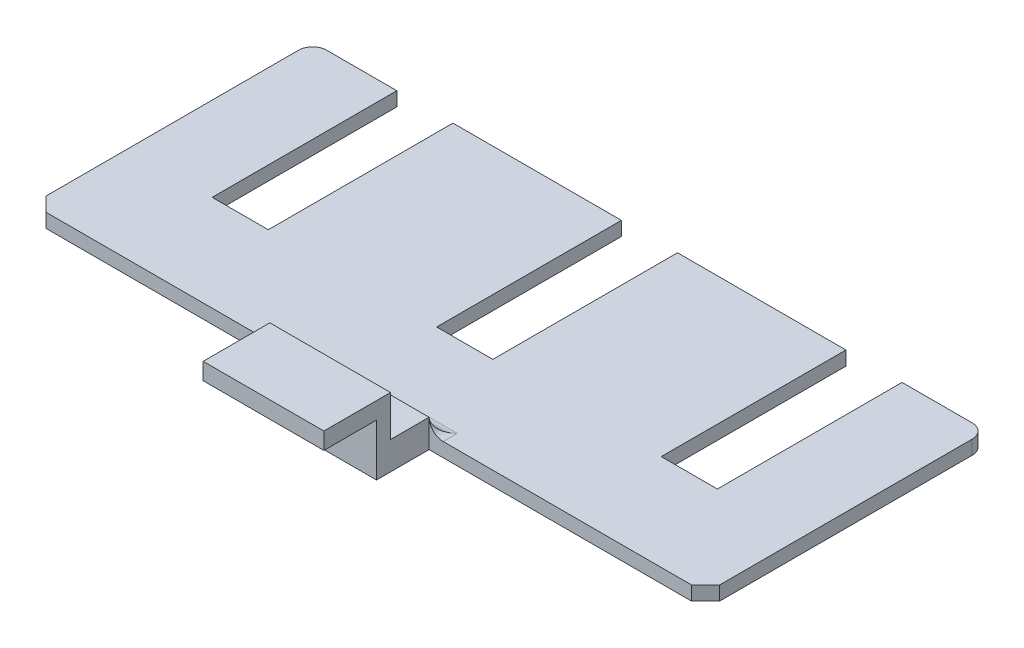
ISO-10303-21;
HEADER;
FILE_DESCRIPTION(('STEP AP214'),'2;1');
FILE_NAME('part.step','',(''),(''),'','','');
FILE_SCHEMA(('AUTOMOTIVE_DESIGN { 1 0 10303 214 1 1 1 1 }'));
ENDSEC;
DATA;
#1=APPLICATION_CONTEXT('core data for automotive mechanical design processes');
#2=APPLICATION_PROTOCOL_DEFINITION('international standard','automotive_design',2000,#1);
#3=PRODUCT_CONTEXT('',#1,'mechanical');
#4=PRODUCT('Part','Part','',(#3));
#5=PRODUCT_RELATED_PRODUCT_CATEGORY('part','',(#4));
#6=PRODUCT_DEFINITION_FORMATION('','',#4);
#7=PRODUCT_DEFINITION_CONTEXT('part definition',#1,'design');
#8=PRODUCT_DEFINITION('design','',#6,#7);
#9=PRODUCT_DEFINITION_SHAPE('','',#8);
#10=(LENGTH_UNIT() NAMED_UNIT(*) SI_UNIT(.MILLI.,.METRE.));
#11=(NAMED_UNIT(*) PLANE_ANGLE_UNIT() SI_UNIT($,.RADIAN.));
#12=(NAMED_UNIT(*) SI_UNIT($,.STERADIAN.) SOLID_ANGLE_UNIT());
#13=UNCERTAINTY_MEASURE_WITH_UNIT(LENGTH_MEASURE(1.E-05),#10,'distance_accuracy_value','');
#14=(GEOMETRIC_REPRESENTATION_CONTEXT(3) GLOBAL_UNCERTAINTY_ASSIGNED_CONTEXT((#13)) GLOBAL_UNIT_ASSIGNED_CONTEXT((#10,
#11,#12)) REPRESENTATION_CONTEXT('',''));
#15=CARTESIAN_POINT('',(0.,0.,0.));
#16=DIRECTION('',(0.,0.,1.));
#17=DIRECTION('',(1.,0.,0.));
#18=AXIS2_PLACEMENT_3D('',#15,#16,#17);
#19=CARTESIAN_POINT('',(53.0000000000001,20.,0.));
#20=DIRECTION('',(0.,0.,1.));
#21=DIRECTION('',(1.,0.,0.));
#22=AXIS2_PLACEMENT_3D('',#19,#20,#21);
#23=CYLINDRICAL_SURFACE('',#22,10.);
#24=CARTESIAN_POINT('',(53.0000000000001,20.,16.1143944231613));
#25=DIRECTION('',(0.707106781186547,0.,0.707106781186548));
#26=DIRECTION('',(-0.707106781186548,0.,0.707106781186547));
#27=AXIS2_PLACEMENT_3D('',#24,#25,#26);
#28=ELLIPSE('',#27,14.1421356237309,10.);
#29=CARTESIAN_POINT('',(53.0000000000001,10.,16.1143944231613));
#30=VERTEX_POINT('',#29);
#31=CARTESIAN_POINT('',(43.0000000000001,20.,26.1143944231613));
#32=VERTEX_POINT('',#31);
#33=EDGE_CURVE('E18',#30,#32,#28,.F.);
#34=ORIENTED_EDGE('',*,*,#33,.T.);
#35=CARTESIAN_POINT('',(53.0000000000001,20.,26.1143944231614));
#36=DIRECTION('',(0.,0.,1.));
#37=DIRECTION('',(1.,0.,0.));
#38=AXIS2_PLACEMENT_3D('',#35,#36,#37);
#39=CIRCLE('',#38,10.);
#40=CARTESIAN_POINT('',(53.,10.,26.1143944231614));
#41=VERTEX_POINT('',#40);
#42=EDGE_CURVE('E220',#41,#32,#39,.F.);
#43=ORIENTED_EDGE('',*,*,#42,.F.);
#44=DIRECTION('',(0.,0.,-1.));
#45=VECTOR('',#44,1.);
#46=CARTESIAN_POINT('',(53.,10.,0.));
#47=LINE('',#46,#45);
#48=EDGE_CURVE('E216',#41,#30,#47,.T.);
#49=ORIENTED_EDGE('',*,*,#48,.T.);
#50=EDGE_LOOP('',(#34,#43,#49));
#51=FACE_BOUND('',#50,.T.);
#52=ADVANCED_FACE('F15',(#51),#23,.F.);
#53=CARTESIAN_POINT('',(-43.,37.,63.6143944231613));
#54=DIRECTION('',(0.,1.,0.));
#55=DIRECTION('',(0.,0.,1.));
#56=AXIS2_PLACEMENT_3D('',#53,#54,#55);
#57=PLANE('',#56);
#58=DIRECTION('',(-1.,0.,0.));
#59=VECTOR('',#58,1.);
#60=CARTESIAN_POINT('',(-43.,37.,101.114394423161));
#61=LINE('',#60,#59);
#62=CARTESIAN_POINT('',(43.,37.,101.114394423161));
#63=VERTEX_POINT('',#62);
#64=CARTESIAN_POINT('',(-43.,37.,101.114394423161));
#65=VERTEX_POINT('',#64);
#66=EDGE_CURVE('E285',#63,#65,#61,.T.);
#67=ORIENTED_EDGE('',*,*,#66,.T.);
#68=DIRECTION('',(0.,0.,1.));
#69=VECTOR('',#68,1.);
#70=CARTESIAN_POINT('',(-43.,37.,63.6143944231614));
#71=LINE('',#70,#69);
#72=CARTESIAN_POINT('',(-43.,37.,63.6143944231614));
#73=VERTEX_POINT('',#72);
#74=EDGE_CURVE('E290',#73,#65,#71,.T.);
#75=ORIENTED_EDGE('',*,*,#74,.F.);
#76=DIRECTION('',(1.,0.,0.));
#77=VECTOR('',#76,1.);
#78=CARTESIAN_POINT('',(43.,37.,63.6143944231614));
#79=LINE('',#78,#77);
#80=CARTESIAN_POINT('',(43.,37.,63.6143944231614));
#81=VERTEX_POINT('',#80);
#82=EDGE_CURVE('E301',#81,#73,#79,.F.);
#83=ORIENTED_EDGE('',*,*,#82,.F.);
#84=DIRECTION('',(0.,0.,-1.));
#85=VECTOR('',#84,1.);
#86=CARTESIAN_POINT('',(43.,37.,63.6143944231614));
#87=LINE('',#86,#85);
#88=EDGE_CURVE('E309',#63,#81,#87,.T.);
#89=ORIENTED_EDGE('',*,*,#88,.F.);
#90=EDGE_LOOP('',(#67,#75,#83,#89));
#91=FACE_BOUND('',#90,.T.);
#92=ADVANCED_FACE('F877',(#91),#57,.F.);
#93=CARTESIAN_POINT('',(-43.,37.,101.114394423161));
#94=DIRECTION('',(0.,0.,-1.));
#95=DIRECTION('',(-1.,0.,0.));
#96=AXIS2_PLACEMENT_3D('',#93,#94,#95);
#97=PLANE('',#96);
#98=DIRECTION('',(1.,0.,0.));
#99=VECTOR('',#98,1.);
#100=CARTESIAN_POINT('',(-43.,49.,101.114394423161));
#101=LINE('',#100,#99);
#102=CARTESIAN_POINT('',(43.,49.,101.114394423161));
#103=VERTEX_POINT('',#102);
#104=CARTESIAN_POINT('',(-43.,49.,101.114394423161));
#105=VERTEX_POINT('',#104);
#106=EDGE_CURVE('E276',#103,#105,#101,.F.);
#107=ORIENTED_EDGE('',*,*,#106,.T.);
#108=DIRECTION('',(0.,1.,0.));
#109=VECTOR('',#108,1.);
#110=CARTESIAN_POINT('',(-43.,10.,101.114394423161));
#111=LINE('',#110,#109);
#112=EDGE_CURVE('E281',#65,#105,#111,.T.);
#113=ORIENTED_EDGE('',*,*,#112,.F.);
#114=ORIENTED_EDGE('',*,*,#66,.F.);
#115=DIRECTION('',(0.,1.,0.));
#116=VECTOR('',#115,1.);
#117=CARTESIAN_POINT('',(43.,10.,101.114394423161));
#118=LINE('',#117,#116);
#119=EDGE_CURVE('E311',#103,#63,#118,.F.);
#120=ORIENTED_EDGE('',*,*,#119,.F.);
#121=EDGE_LOOP('',(#107,#113,#114,#120));
#122=FACE_BOUND('',#121,.T.);
#123=ADVANCED_FACE('F884',(#122),#97,.F.);
#124=CARTESIAN_POINT('',(-43.,49.,101.114394423161));
#125=DIRECTION('',(0.,-1.,0.));
#126=DIRECTION('',(0.,0.,-1.));
#127=AXIS2_PLACEMENT_3D('',#124,#125,#126);
#128=PLANE('',#127);
#129=DIRECTION('',(1.,0.,0.));
#130=VECTOR('',#129,1.);
#131=CARTESIAN_POINT('',(-43.,49.,53.6143944231613));
#132=LINE('',#131,#130);
#133=CARTESIAN_POINT('',(43.,49.,53.6143944231614));
#134=VERTEX_POINT('',#133);
#135=CARTESIAN_POINT('',(-43.,49.,53.6143944231613));
#136=VERTEX_POINT('',#135);
#137=EDGE_CURVE('E265',#134,#136,#132,.F.);
#138=ORIENTED_EDGE('',*,*,#137,.T.);
#139=DIRECTION('',(0.,0.,1.));
#140=VECTOR('',#139,1.);
#141=CARTESIAN_POINT('',(-43.,49.,63.6143944231614));
#142=LINE('',#141,#140);
#143=EDGE_CURVE('E272',#105,#136,#142,.F.);
#144=ORIENTED_EDGE('',*,*,#143,.F.);
#145=ORIENTED_EDGE('',*,*,#106,.F.);
#146=DIRECTION('',(0.,0.,-1.));
#147=VECTOR('',#146,1.);
#148=CARTESIAN_POINT('',(43.,49.,63.6143944231614));
#149=LINE('',#148,#147);
#150=EDGE_CURVE('E316',#134,#103,#149,.F.);
#151=ORIENTED_EDGE('',*,*,#150,.F.);
#152=EDGE_LOOP('',(#138,#144,#145,#151));
#153=FACE_BOUND('',#152,.T.);
#154=ADVANCED_FACE('F892',(#153),#128,.F.);
#155=CARTESIAN_POINT('',(-43.,49.,53.6143944231613));
#156=DIRECTION('',(0.,0.,1.));
#157=DIRECTION('',(0.,-1.,0.));
#158=AXIS2_PLACEMENT_3D('',#155,#156,#157);
#159=PLANE('',#158);
#160=DIRECTION('',(1.,0.,0.));
#161=VECTOR('',#160,1.);
#162=CARTESIAN_POINT('',(-43.,20.,53.6143944231614));
#163=LINE('',#162,#161);
#164=CARTESIAN_POINT('',(43.,20.,53.6143944231614));
#165=VERTEX_POINT('',#164);
#166=CARTESIAN_POINT('',(-43.,20.,53.6143944231613));
#167=VERTEX_POINT('',#166);
#168=EDGE_CURVE('E226',#165,#167,#163,.F.);
#169=ORIENTED_EDGE('',*,*,#168,.T.);
#170=DIRECTION('',(0.,1.,0.));
#171=VECTOR('',#170,1.);
#172=CARTESIAN_POINT('',(-43.,10.,53.6143944231613));
#173=LINE('',#172,#171);
#174=EDGE_CURVE('E268',#136,#167,#173,.F.);
#175=ORIENTED_EDGE('',*,*,#174,.F.);
#176=ORIENTED_EDGE('',*,*,#137,.F.);
#177=DIRECTION('',(0.,1.,0.));
#178=VECTOR('',#177,1.);
#179=CARTESIAN_POINT('',(43.,10.,53.6143944231614));
#180=LINE('',#179,#178);
#181=EDGE_CURVE('E246',#165,#134,#180,.T.);
#182=ORIENTED_EDGE('',*,*,#181,.F.);
#183=EDGE_LOOP('',(#169,#175,#176,#182));
#184=FACE_BOUND('',#183,.T.);
#185=ADVANCED_FACE('F901',(#184),#159,.F.);
#186=CARTESIAN_POINT('',(-43.,20.,53.6143944231613));
#187=DIRECTION('',(0.,-1.,0.));
#188=DIRECTION('',(0.,0.,-1.));
#189=AXIS2_PLACEMENT_3D('',#186,#187,#188);
#190=PLANE('',#189);
#191=DIRECTION('',(-1.,0.,0.));
#192=VECTOR('',#191,1.);
#193=CARTESIAN_POINT('',(0.,20.,26.1143944231612));
#194=LINE('',#193,#192);
#195=CARTESIAN_POINT('',(-43.,20.,26.1143944231612));
#196=VERTEX_POINT('',#195);
#197=EDGE_CURVE('E225',#32,#196,#194,.T.);
#198=ORIENTED_EDGE('',*,*,#197,.T.);
#199=DIRECTION('',(0.,0.,1.));
#200=VECTOR('',#199,1.);
#201=CARTESIAN_POINT('',(-43.,20.,63.6143944231614));
#202=LINE('',#201,#200);
#203=EDGE_CURVE('E271',#167,#196,#202,.F.);
#204=ORIENTED_EDGE('',*,*,#203,.F.);
#205=ORIENTED_EDGE('',*,*,#168,.F.);
#206=DIRECTION('',(0.,0.,-1.));
#207=VECTOR('',#206,1.);
#208=CARTESIAN_POINT('',(43.,20.,63.6143944231614));
#209=LINE('',#208,#207);
#210=EDGE_CURVE('E234',#32,#165,#209,.F.);
#211=ORIENTED_EDGE('',*,*,#210,.F.);
#212=EDGE_LOOP('',(#198,#204,#205,#211));
#213=FACE_BOUND('',#212,.T.);
#214=ADVANCED_FACE('F242',(#213),#190,.F.);
#215=CARTESIAN_POINT('',(0.,20.,16.1143944231612));
#216=DIRECTION('',(-1.,0.,0.));
#217=DIRECTION('',(0.,0.,1.));
#218=AXIS2_PLACEMENT_3D('',#215,#216,#217);
#219=CYLINDRICAL_SURFACE('',#218,10.);
#220=ORIENTED_EDGE('',*,*,#197,.F.);
#221=ORIENTED_EDGE('',*,*,#33,.F.);
#222=DIRECTION('',(1.,0.,0.));
#223=VECTOR('',#222,1.);
#224=CARTESIAN_POINT('',(0.,10.,16.1143944231612));
#225=LINE('',#224,#223);
#226=CARTESIAN_POINT('',(-43.,10.,16.1143944231612));
#227=VERTEX_POINT('',#226);
#228=EDGE_CURVE('E258',#30,#227,#225,.F.);
#229=ORIENTED_EDGE('',*,*,#228,.T.);
#230=CARTESIAN_POINT('',(-43.,20.,16.1143944231612));
#231=DIRECTION('',(-1.,0.,0.));
#232=DIRECTION('',(0.,0.,1.));
#233=AXIS2_PLACEMENT_3D('',#230,#231,#232);
#234=CIRCLE('',#233,10.);
#235=EDGE_CURVE('E255',#196,#227,#234,.F.);
#236=ORIENTED_EDGE('',*,*,#235,.F.);
#237=EDGE_LOOP('',(#220,#221,#229,#236));
#238=FACE_BOUND('',#237,.T.);
#239=ADVANCED_FACE('F253',(#238),#219,.F.);
#240=CARTESIAN_POINT('',(0.,10.,0.));
#241=DIRECTION('',(0.,-1.,0.));
#242=DIRECTION('',(0.,0.,-1.));
#243=AXIS2_PLACEMENT_3D('',#240,#241,#242);
#244=PLANE('',#243);
#245=ORIENTED_EDGE('',*,*,#48,.F.);
#246=DIRECTION('',(1.,0.,0.));
#247=VECTOR('',#246,1.);
#248=CARTESIAN_POINT('',(43.,10.,26.1143944231614));
#249=LINE('',#248,#247);
#250=CARTESIAN_POINT('',(230.,10.,26.1143944231614));
#251=VERTEX_POINT('',#250);
#252=EDGE_CURVE('E251',#251,#41,#249,.F.);
#253=ORIENTED_EDGE('',*,*,#252,.F.);
#254=DIRECTION('',(-0.707106781186548,0.,0.707106781186547));
#255=VECTOR('',#254,1.);
#256=CARTESIAN_POINT('',(240.,10.,16.1143944231614));
#257=LINE('',#256,#255);
#258=CARTESIAN_POINT('',(240.,10.,16.1143944231614));
#259=VERTEX_POINT('',#258);
#260=EDGE_CURVE('E328',#251,#259,#257,.F.);
#261=ORIENTED_EDGE('',*,*,#260,.T.);
#262=DIRECTION('',(0.,0.,-1.));
#263=VECTOR('',#262,1.);
#264=CARTESIAN_POINT('',(240.,10.,-173.885605576839));
#265=LINE('',#264,#263);
#266=CARTESIAN_POINT('',(240.,10.,-163.885605576839));
#267=VERTEX_POINT('',#266);
#268=EDGE_CURVE('E335',#267,#259,#265,.F.);
#269=ORIENTED_EDGE('',*,*,#268,.F.);
#270=CARTESIAN_POINT('',(230.,10.,-163.885605576839));
#271=DIRECTION('',(0.,-1.,0.));
#272=DIRECTION('',(0.,0.,-1.));
#273=AXIS2_PLACEMENT_3D('',#270,#271,#272);
#274=CIRCLE('',#273,10.);
#275=CARTESIAN_POINT('',(230.,10.,-173.885605576839));
#276=VERTEX_POINT('',#275);
#277=EDGE_CURVE('E343',#276,#267,#274,.T.);
#278=ORIENTED_EDGE('',*,*,#277,.F.);
#279=DIRECTION('',(-1.,0.,0.));
#280=VECTOR('',#279,1.);
#281=CARTESIAN_POINT('',(-240.,10.,-173.885605576839));
#282=LINE('',#281,#280);
#283=CARTESIAN_POINT('',(180.,10.,-173.885605576839));
#284=VERTEX_POINT('',#283);
#285=EDGE_CURVE('E340',#284,#276,#282,.F.);
#286=ORIENTED_EDGE('',*,*,#285,.F.);
#287=DIRECTION('',(0.,0.,1.));
#288=VECTOR('',#287,1.);
#289=CARTESIAN_POINT('',(180.,10.,-42.2906522512844));
#290=LINE('',#289,#288);
#291=CARTESIAN_POINT('',(180.,10.,-42.2906522512844));
#292=VERTEX_POINT('',#291);
#293=EDGE_CURVE('E347',#292,#284,#290,.F.);
#294=ORIENTED_EDGE('',*,*,#293,.F.);
#295=DIRECTION('',(-1.,0.,0.));
#296=VECTOR('',#295,1.);
#297=CARTESIAN_POINT('',(140.,10.,-42.2906522512844));
#298=LINE('',#297,#296);
#299=CARTESIAN_POINT('',(140.,10.,-42.2906522512844));
#300=VERTEX_POINT('',#299);
#301=EDGE_CURVE('E308',#300,#292,#298,.F.);
#302=ORIENTED_EDGE('',*,*,#301,.F.);
#303=DIRECTION('',(0.,0.,-1.));
#304=VECTOR('',#303,1.);
#305=CARTESIAN_POINT('',(140.,10.,-292.954304526664));
#306=LINE('',#305,#304);
#307=CARTESIAN_POINT('',(140.,10.,-173.885605576839));
#308=VERTEX_POINT('',#307);
#309=EDGE_CURVE('E407',#308,#300,#306,.F.);
#310=ORIENTED_EDGE('',*,*,#309,.F.);
#311=DIRECTION('',(-1.,0.,0.));
#312=VECTOR('',#311,1.);
#313=CARTESIAN_POINT('',(-240.,10.,-173.885605576839));
#314=LINE('',#313,#312);
#315=CARTESIAN_POINT('',(20.,10.,-173.885605576839));
#316=VERTEX_POINT('',#315);
#317=EDGE_CURVE('E420',#316,#308,#314,.F.);
#318=ORIENTED_EDGE('',*,*,#317,.F.);
#319=DIRECTION('',(0.,0.,1.));
#320=VECTOR('',#319,1.);
#321=CARTESIAN_POINT('',(20.,10.,-42.2906522512844));
#322=LINE('',#321,#320);
#323=CARTESIAN_POINT('',(20.,10.,-42.2906522512844));
#324=VERTEX_POINT('',#323);
#325=EDGE_CURVE('E422',#324,#316,#322,.F.);
#326=ORIENTED_EDGE('',*,*,#325,.F.);
#327=DIRECTION('',(-1.,0.,0.));
#328=VECTOR('',#327,1.);
#329=CARTESIAN_POINT('',(-20.,10.,-42.2906522512844));
#330=LINE('',#329,#328);
#331=CARTESIAN_POINT('',(-20.,10.,-42.2906522512844));
#332=VERTEX_POINT('',#331);
#333=EDGE_CURVE('E442',#332,#324,#330,.F.);
#334=ORIENTED_EDGE('',*,*,#333,.F.);
#335=DIRECTION('',(0.,0.,-1.));
#336=VECTOR('',#335,1.);
#337=CARTESIAN_POINT('',(-20.,10.,-305.480558902393));
#338=LINE('',#337,#336);
#339=CARTESIAN_POINT('',(-20.,10.,-173.885605576839));
#340=VERTEX_POINT('',#339);
#341=EDGE_CURVE('E458',#340,#332,#338,.F.);
#342=ORIENTED_EDGE('',*,*,#341,.F.);
#343=DIRECTION('',(-1.,0.,0.));
#344=VECTOR('',#343,1.);
#345=CARTESIAN_POINT('',(-240.,10.,-173.885605576839));
#346=LINE('',#345,#344);
#347=CARTESIAN_POINT('',(-140.,10.,-173.885605576839));
#348=VERTEX_POINT('',#347);
#349=EDGE_CURVE('E468',#348,#340,#346,.F.);
#350=ORIENTED_EDGE('',*,*,#349,.F.);
#351=DIRECTION('',(0.,0.,-1.));
#352=VECTOR('',#351,1.);
#353=CARTESIAN_POINT('',(-140.,10.,-305.480558902393));
#354=LINE('',#353,#352);
#355=CARTESIAN_POINT('',(-140.,10.,-42.2906522512844));
#356=VERTEX_POINT('',#355);
#357=EDGE_CURVE('E478',#348,#356,#354,.F.);
#358=ORIENTED_EDGE('',*,*,#357,.T.);
#359=DIRECTION('',(1.,0.,0.));
#360=VECTOR('',#359,1.);
#361=CARTESIAN_POINT('',(-140.,10.,-42.2906522512844));
#362=LINE('',#361,#360);
#363=CARTESIAN_POINT('',(-180.,10.,-42.2906522512844));
#364=VERTEX_POINT('',#363);
#365=EDGE_CURVE('E487',#356,#364,#362,.F.);
#366=ORIENTED_EDGE('',*,*,#365,.T.);
#367=DIRECTION('',(0.,0.,1.));
#368=VECTOR('',#367,1.);
#369=CARTESIAN_POINT('',(-180.,10.,-42.2906522512844));
#370=LINE('',#369,#368);
#371=CARTESIAN_POINT('',(-180.,10.,-173.885605576839));
#372=VERTEX_POINT('',#371);
#373=EDGE_CURVE('E495',#364,#372,#370,.F.);
#374=ORIENTED_EDGE('',*,*,#373,.T.);
#375=DIRECTION('',(-1.,0.,0.));
#376=VECTOR('',#375,1.);
#377=CARTESIAN_POINT('',(-240.,10.,-173.885605576839));
#378=LINE('',#377,#376);
#379=CARTESIAN_POINT('',(-230.,10.,-173.885605576839));
#380=VERTEX_POINT('',#379);
#381=EDGE_CURVE('E497',#380,#372,#378,.F.);
#382=ORIENTED_EDGE('',*,*,#381,.F.);
#383=CARTESIAN_POINT('',(-230.,10.,-163.885605576839));
#384=DIRECTION('',(0.,-1.,0.));
#385=DIRECTION('',(0.,0.,-1.));
#386=AXIS2_PLACEMENT_3D('',#383,#384,#385);
#387=CIRCLE('',#386,10.);
#388=CARTESIAN_POINT('',(-240.,10.,-163.885605576839));
#389=VERTEX_POINT('',#388);
#390=EDGE_CURVE('E367',#389,#380,#387,.T.);
#391=ORIENTED_EDGE('',*,*,#390,.F.);
#392=DIRECTION('',(0.,0.,1.));
#393=VECTOR('',#392,1.);
#394=CARTESIAN_POINT('',(-240.,10.,26.1143944231614));
#395=LINE('',#394,#393);
#396=CARTESIAN_POINT('',(-240.,10.,16.1143944231614));
#397=VERTEX_POINT('',#396);
#398=EDGE_CURVE('E508',#397,#389,#395,.F.);
#399=ORIENTED_EDGE('',*,*,#398,.F.);
#400=DIRECTION('',(-0.707106781186548,0.,-0.707106781186547));
#401=VECTOR('',#400,1.);
#402=CARTESIAN_POINT('',(-230.,10.,26.1143944231614));
#403=LINE('',#402,#401);
#404=CARTESIAN_POINT('',(-230.,10.,26.1143944231614));
#405=VERTEX_POINT('',#404);
#406=EDGE_CURVE('E511',#397,#405,#403,.F.);
#407=ORIENTED_EDGE('',*,*,#406,.T.);
#408=DIRECTION('',(1.,0.,0.));
#409=VECTOR('',#408,1.);
#410=CARTESIAN_POINT('',(-43.,10.,26.1143944231614));
#411=LINE('',#410,#409);
#412=CARTESIAN_POINT('',(-53.,10.,26.1143944231614));
#413=VERTEX_POINT('',#412);
#414=EDGE_CURVE('E518',#413,#405,#411,.F.);
#415=ORIENTED_EDGE('',*,*,#414,.F.);
#416=CARTESIAN_POINT('',(-53.,10.,36.1143944231614));
#417=DIRECTION('',(0.,1.,0.));
#418=DIRECTION('',(0.,0.,1.));
#419=AXIS2_PLACEMENT_3D('',#416,#417,#418);
#420=CIRCLE('',#419,10.);
#421=CARTESIAN_POINT('',(-43.,10.,36.1143944231614));
#422=VERTEX_POINT('',#421);
#423=EDGE_CURVE('E371',#413,#422,#420,.F.);
#424=ORIENTED_EDGE('',*,*,#423,.T.);
#425=DIRECTION('',(0.,0.,1.));
#426=VECTOR('',#425,1.);
#427=CARTESIAN_POINT('',(-43.,10.,63.6143944231614));
#428=LINE('',#427,#426);
#429=EDGE_CURVE('E303',#227,#422,#428,.T.);
#430=ORIENTED_EDGE('',*,*,#429,.F.);
#431=ORIENTED_EDGE('',*,*,#228,.F.);
#432=EDGE_LOOP('',(#245,#253,#261,#269,#278,#286,#294,#302,#310,#318,#326,#334,#342,#350,#358,
#366,#374,#382,#391,#399,#407,#415,#424,#430,#431));
#433=FACE_BOUND('',#432,.T.);
#434=ADVANCED_FACE('F667',(#433),#244,.F.);
#435=CARTESIAN_POINT('',(140.,893.833867962853,-42.2906522512844));
#436=DIRECTION('',(0.,0.,-1.));
#437=DIRECTION('',(-1.,0.,0.));
#438=AXIS2_PLACEMENT_3D('',#435,#436,#437);
#439=PLANE('',#438);
#440=DIRECTION('',(1.,0.,0.));
#441=VECTOR('',#440,1.);
#442=CARTESIAN_POINT('',(0.,0.,-42.2906522512844));
#443=LINE('',#442,#441);
#444=CARTESIAN_POINT('',(140.,0.,-42.2906522512844));
#445=VERTEX_POINT('',#444);
#446=CARTESIAN_POINT('',(180.,0.,-42.2906522512844));
#447=VERTEX_POINT('',#446);
#448=EDGE_CURVE('E393',#445,#447,#443,.T.);
#449=ORIENTED_EDGE('',*,*,#448,.F.);
#450=DIRECTION('',(0.,1.,0.));
#451=VECTOR('',#450,1.);
#452=CARTESIAN_POINT('',(140.,893.833867962853,-42.2906522512844));
#453=LINE('',#452,#451);
#454=EDGE_CURVE('E404',#300,#445,#453,.F.);
#455=ORIENTED_EDGE('',*,*,#454,.F.);
#456=ORIENTED_EDGE('',*,*,#301,.T.);
#457=DIRECTION('',(0.,1.,0.));
#458=VECTOR('',#457,1.);
#459=CARTESIAN_POINT('',(180.,893.833867962853,-42.2906522512844));
#460=LINE('',#459,#458);
#461=EDGE_CURVE('E349',#447,#292,#460,.T.);
#462=ORIENTED_EDGE('',*,*,#461,.F.);
#463=EDGE_LOOP('',(#449,#455,#456,#462));
#464=FACE_BOUND('',#463,.T.);
#465=ADVANCED_FACE('F673',(#464),#439,.T.);
#466=CARTESIAN_POINT('',(180.,893.833867962853,-42.2906522512844));
#467=DIRECTION('',(-1.,0.,0.));
#468=DIRECTION('',(0.,0.,1.));
#469=AXIS2_PLACEMENT_3D('',#466,#467,#468);
#470=PLANE('',#469);
#471=ORIENTED_EDGE('',*,*,#293,.T.);
#472=DIRECTION('',(0.,1.,0.));
#473=VECTOR('',#472,1.);
#474=CARTESIAN_POINT('',(180.,10.,-173.885605576839));
#475=LINE('',#474,#473);
#476=CARTESIAN_POINT('',(180.,0.,-173.885605576839));
#477=VERTEX_POINT('',#476);
#478=EDGE_CURVE('E344',#477,#284,#475,.T.);
#479=ORIENTED_EDGE('',*,*,#478,.F.);
#480=DIRECTION('',(0.,0.,-1.));
#481=VECTOR('',#480,1.);
#482=CARTESIAN_POINT('',(180.,0.,0.));
#483=LINE('',#482,#481);
#484=EDGE_CURVE('E390',#447,#477,#483,.T.);
#485=ORIENTED_EDGE('',*,*,#484,.F.);
#486=ORIENTED_EDGE('',*,*,#461,.T.);
#487=EDGE_LOOP('',(#471,#479,#485,#486));
#488=FACE_BOUND('',#487,.T.);
#489=ADVANCED_FACE('F677',(#488),#470,.T.);
#490=CARTESIAN_POINT('',(-240.,10.,-173.885605576839));
#491=DIRECTION('',(0.,0.,-1.));
#492=DIRECTION('',(-1.,0.,0.));
#493=AXIS2_PLACEMENT_3D('',#490,#491,#492);
#494=PLANE('',#493);
#495=ORIENTED_EDGE('',*,*,#285,.T.);
#496=DIRECTION('',(0.,-1.,0.));
#497=VECTOR('',#496,1.);
#498=CARTESIAN_POINT('',(230.,10.,-173.885605576839));
#499=LINE('',#498,#497);
#500=CARTESIAN_POINT('',(230.,0.,-173.885605576839));
#501=VERTEX_POINT('',#500);
#502=EDGE_CURVE('E376',#501,#276,#499,.F.);
#503=ORIENTED_EDGE('',*,*,#502,.F.);
#504=DIRECTION('',(1.,0.,0.));
#505=VECTOR('',#504,1.);
#506=CARTESIAN_POINT('',(0.,0.,-173.885605576839));
#507=LINE('',#506,#505);
#508=EDGE_CURVE('E366',#477,#501,#507,.T.);
#509=ORIENTED_EDGE('',*,*,#508,.F.);
#510=ORIENTED_EDGE('',*,*,#478,.T.);
#511=EDGE_LOOP('',(#495,#503,#509,#510));
#512=FACE_BOUND('',#511,.T.);
#513=ADVANCED_FACE('F680',(#512),#494,.T.);
#514=CARTESIAN_POINT('',(230.,10.,-163.885605576839));
#515=DIRECTION('',(0.,-1.,0.));
#516=DIRECTION('',(0.,0.,-1.));
#517=AXIS2_PLACEMENT_3D('',#514,#515,#516);
#518=CYLINDRICAL_SURFACE('',#517,10.);
#519=CARTESIAN_POINT('',(230.,0.,-163.885605576839));
#520=DIRECTION('',(0.,-1.,0.));
#521=DIRECTION('',(0.,0.,-1.));
#522=AXIS2_PLACEMENT_3D('',#519,#520,#521);
#523=CIRCLE('',#522,10.);
#524=CARTESIAN_POINT('',(240.,0.,-163.885605576839));
#525=VERTEX_POINT('',#524);
#526=EDGE_CURVE('E362',#501,#525,#523,.T.);
#527=ORIENTED_EDGE('',*,*,#526,.F.);
#528=ORIENTED_EDGE('',*,*,#502,.T.);
#529=ORIENTED_EDGE('',*,*,#277,.T.);
#530=DIRECTION('',(0.,1.,0.));
#531=VECTOR('',#530,1.);
#532=CARTESIAN_POINT('',(240.,10.,-163.885605576839));
#533=LINE('',#532,#531);
#534=EDGE_CURVE('E337',#525,#267,#533,.T.);
#535=ORIENTED_EDGE('',*,*,#534,.F.);
#536=EDGE_LOOP('',(#527,#528,#529,#535));
#537=FACE_BOUND('',#536,.T.);
#538=ADVANCED_FACE('F681',(#537),#518,.T.);
#539=CARTESIAN_POINT('',(240.,10.,-173.885605576839));
#540=DIRECTION('',(1.,0.,0.));
#541=DIRECTION('',(0.,0.,-1.));
#542=AXIS2_PLACEMENT_3D('',#539,#540,#541);
#543=PLANE('',#542);
#544=ORIENTED_EDGE('',*,*,#268,.T.);
#545=DIRECTION('',(0.,1.,0.));
#546=VECTOR('',#545,1.);
#547=CARTESIAN_POINT('',(240.,10.,16.1143944231614));
#548=LINE('',#547,#546);
#549=CARTESIAN_POINT('',(240.,0.,16.1143944231614));
#550=VERTEX_POINT('',#549);
#551=EDGE_CURVE('E332',#259,#550,#548,.F.);
#552=ORIENTED_EDGE('',*,*,#551,.T.);
#553=DIRECTION('',(0.,0.,-1.));
#554=VECTOR('',#553,1.);
#555=CARTESIAN_POINT('',(240.,0.,0.));
#556=LINE('',#555,#554);
#557=EDGE_CURVE('E365',#525,#550,#556,.F.);
#558=ORIENTED_EDGE('',*,*,#557,.F.);
#559=ORIENTED_EDGE('',*,*,#534,.T.);
#560=EDGE_LOOP('',(#544,#552,#558,#559));
#561=FACE_BOUND('',#560,.T.);
#562=ADVANCED_FACE('F571',(#561),#543,.T.);
#563=CARTESIAN_POINT('',(240.,10.,16.1143944231614));
#564=DIRECTION('',(-0.707106781186547,0.,-0.707106781186548));
#565=DIRECTION('',(-0.707106781186548,0.,0.707106781186547));
#566=AXIS2_PLACEMENT_3D('',#563,#564,#565);
#567=PLANE('',#566);
#568=DIRECTION('',(0.,1.,0.));
#569=VECTOR('',#568,1.);
#570=CARTESIAN_POINT('',(230.,10.,26.1143944231614));
#571=LINE('',#570,#569);
#572=CARTESIAN_POINT('',(230.,0.,26.1143944231614));
#573=VERTEX_POINT('',#572);
#574=EDGE_CURVE('E331',#573,#251,#571,.T.);
#575=ORIENTED_EDGE('',*,*,#574,.F.);
#576=DIRECTION('',(-0.707106781186547,0.,0.707106781186548));
#577=VECTOR('',#576,1.);
#578=CARTESIAN_POINT('',(240.,0.,16.1143944231614));
#579=LINE('',#578,#577);
#580=EDGE_CURVE('E553',#550,#573,#579,.T.);
#581=ORIENTED_EDGE('',*,*,#580,.F.);
#582=ORIENTED_EDGE('',*,*,#551,.F.);
#583=ORIENTED_EDGE('',*,*,#260,.F.);
#584=EDGE_LOOP('',(#575,#581,#582,#583));
#585=FACE_BOUND('',#584,.T.);
#586=ADVANCED_FACE('F574',(#585),#567,.F.);
#587=CARTESIAN_POINT('',(43.,10.,26.1143944231614));
#588=DIRECTION('',(0.,0.,1.));
#589=DIRECTION('',(1.,0.,0.));
#590=AXIS2_PLACEMENT_3D('',#587,#588,#589);
#591=PLANE('',#590);
#592=ORIENTED_EDGE('',*,*,#42,.T.);
#593=DIRECTION('',(0.,1.,0.));
#594=VECTOR('',#593,1.);
#595=CARTESIAN_POINT('',(43.,10.,26.1143944231614));
#596=LINE('',#595,#594);
#597=CARTESIAN_POINT('',(43.,0.,26.1143944231614));
#598=VERTEX_POINT('',#597);
#599=EDGE_CURVE('E230',#598,#32,#596,.T.);
#600=ORIENTED_EDGE('',*,*,#599,.F.);
#601=DIRECTION('',(1.,0.,0.));
#602=VECTOR('',#601,1.);
#603=CARTESIAN_POINT('',(0.,0.,26.1143944231614));
#604=LINE('',#603,#602);
#605=EDGE_CURVE('E547',#573,#598,#604,.F.);
#606=ORIENTED_EDGE('',*,*,#605,.F.);
#607=ORIENTED_EDGE('',*,*,#574,.T.);
#608=ORIENTED_EDGE('',*,*,#252,.T.);
#609=EDGE_LOOP('',(#592,#600,#606,#607,#608));
#610=FACE_BOUND('',#609,.T.);
#611=ADVANCED_FACE('F248',(#610),#591,.T.);
#612=CARTESIAN_POINT('',(43.,10.,63.6143944231614));
#613=DIRECTION('',(1.,0.,0.));
#614=DIRECTION('',(0.,0.,-1.));
#615=AXIS2_PLACEMENT_3D('',#612,#613,#614);
#616=PLANE('',#615);
#617=DIRECTION('',(0.,1.,0.));
#618=VECTOR('',#617,1.);
#619=CARTESIAN_POINT('',(43.,10.,63.6143944231614));
#620=LINE('',#619,#618);
#621=CARTESIAN_POINT('',(43.,0.,63.6143944231614));
#622=VERTEX_POINT('',#621);
#623=EDGE_CURVE('E304',#622,#81,#620,.T.);
#624=ORIENTED_EDGE('',*,*,#623,.F.);
#625=DIRECTION('',(0.,0.,-1.));
#626=VECTOR('',#625,1.);
#627=CARTESIAN_POINT('',(43.,0.,0.));
#628=LINE('',#627,#626);
#629=EDGE_CURVE('E236',#598,#622,#628,.F.);
#630=ORIENTED_EDGE('',*,*,#629,.F.);
#631=ORIENTED_EDGE('',*,*,#599,.T.);
#632=ORIENTED_EDGE('',*,*,#210,.T.);
#633=ORIENTED_EDGE('',*,*,#181,.T.);
#634=ORIENTED_EDGE('',*,*,#150,.T.);
#635=ORIENTED_EDGE('',*,*,#119,.T.);
#636=ORIENTED_EDGE('',*,*,#88,.T.);
#637=EDGE_LOOP('',(#624,#630,#631,#632,#633,#634,#635,#636));
#638=FACE_BOUND('',#637,.T.);
#639=ADVANCED_FACE('F232',(#638),#616,.T.);
#640=CARTESIAN_POINT('',(43.,10.,63.6143944231614));
#641=DIRECTION('',(0.,0.,1.));
#642=DIRECTION('',(1.,0.,0.));
#643=AXIS2_PLACEMENT_3D('',#640,#641,#642);
#644=PLANE('',#643);
#645=ORIENTED_EDGE('',*,*,#82,.T.);
#646=DIRECTION('',(0.,1.,0.));
#647=VECTOR('',#646,1.);
#648=CARTESIAN_POINT('',(-43.,10.,63.6143944231614));
#649=LINE('',#648,#647);
#650=CARTESIAN_POINT('',(-43.,0.,63.6143944231614));
#651=VERTEX_POINT('',#650);
#652=EDGE_CURVE('E298',#651,#73,#649,.T.);
#653=ORIENTED_EDGE('',*,*,#652,.F.);
#654=DIRECTION('',(1.,0.,0.));
#655=VECTOR('',#654,1.);
#656=CARTESIAN_POINT('',(0.,0.,63.6143944231614));
#657=LINE('',#656,#655);
#658=EDGE_CURVE('E537',#622,#651,#657,.F.);
#659=ORIENTED_EDGE('',*,*,#658,.F.);
#660=ORIENTED_EDGE('',*,*,#623,.T.);
#661=EDGE_LOOP('',(#645,#653,#659,#660));
#662=FACE_BOUND('',#661,.T.);
#663=ADVANCED_FACE('F742',(#662),#644,.T.);
#664=CARTESIAN_POINT('',(-43.,10.,63.6143944231614));
#665=DIRECTION('',(-1.,0.,0.));
#666=DIRECTION('',(0.,0.,1.));
#667=AXIS2_PLACEMENT_3D('',#664,#665,#666);
#668=PLANE('',#667);
#669=ORIENTED_EDGE('',*,*,#203,.T.);
#670=ORIENTED_EDGE('',*,*,#235,.T.);
#671=ORIENTED_EDGE('',*,*,#429,.T.);
#672=DIRECTION('',(0.,1.,0.));
#673=VECTOR('',#672,1.);
#674=CARTESIAN_POINT('',(-43.,10.,36.1143944231614));
#675=LINE('',#674,#673);
#676=CARTESIAN_POINT('',(-43.,0.,36.1143944231614));
#677=VERTEX_POINT('',#676);
#678=EDGE_CURVE('E375',#422,#677,#675,.F.);
#679=ORIENTED_EDGE('',*,*,#678,.T.);
#680=DIRECTION('',(0.,0.,-1.));
#681=VECTOR('',#680,1.);
#682=CARTESIAN_POINT('',(-43.,0.,0.));
#683=LINE('',#682,#681);
#684=EDGE_CURVE('E361',#651,#677,#683,.T.);
#685=ORIENTED_EDGE('',*,*,#684,.F.);
#686=ORIENTED_EDGE('',*,*,#652,.T.);
#687=ORIENTED_EDGE('',*,*,#74,.T.);
#688=ORIENTED_EDGE('',*,*,#112,.T.);
#689=ORIENTED_EDGE('',*,*,#143,.T.);
#690=ORIENTED_EDGE('',*,*,#174,.T.);
#691=EDGE_LOOP('',(#669,#670,#671,#679,#685,#686,#687,#688,#689,#690));
#692=FACE_BOUND('',#691,.T.);
#693=ADVANCED_FACE('F624',(#692),#668,.T.);
#694=CARTESIAN_POINT('',(-53.,10.,36.1143944231614));
#695=DIRECTION('',(0.,1.,0.));
#696=DIRECTION('',(0.,0.,1.));
#697=AXIS2_PLACEMENT_3D('',#694,#695,#696);
#698=CYLINDRICAL_SURFACE('',#697,10.);
#699=DIRECTION('',(0.,1.,0.));
#700=VECTOR('',#699,1.);
#701=CARTESIAN_POINT('',(-53.,10.,26.1143944231614));
#702=LINE('',#701,#700);
#703=CARTESIAN_POINT('',(-53.,0.,26.1143944231614));
#704=VERTEX_POINT('',#703);
#705=EDGE_CURVE('E374',#704,#413,#702,.T.);
#706=ORIENTED_EDGE('',*,*,#705,.F.);
#707=CARTESIAN_POINT('',(-53.,0.,36.1143944231614));
#708=DIRECTION('',(0.,1.,0.));
#709=DIRECTION('',(0.,0.,1.));
#710=AXIS2_PLACEMENT_3D('',#707,#708,#709);
#711=CIRCLE('',#710,10.);
#712=EDGE_CURVE('E357',#677,#704,#711,.T.);
#713=ORIENTED_EDGE('',*,*,#712,.F.);
#714=ORIENTED_EDGE('',*,*,#678,.F.);
#715=ORIENTED_EDGE('',*,*,#423,.F.);
#716=EDGE_LOOP('',(#706,#713,#714,#715));
#717=FACE_BOUND('',#716,.T.);
#718=ADVANCED_FACE('F628',(#717),#698,.F.);
#719=CARTESIAN_POINT('',(-43.,10.,26.1143944231614));
#720=DIRECTION('',(0.,0.,1.));
#721=DIRECTION('',(1.,0.,0.));
#722=AXIS2_PLACEMENT_3D('',#719,#720,#721);
#723=PLANE('',#722);
#724=ORIENTED_EDGE('',*,*,#414,.T.);
#725=DIRECTION('',(0.,1.,0.));
#726=VECTOR('',#725,1.);
#727=CARTESIAN_POINT('',(-230.,10.,26.1143944231614));
#728=LINE('',#727,#726);
#729=CARTESIAN_POINT('',(-230.,0.,26.1143944231614));
#730=VERTEX_POINT('',#729);
#731=EDGE_CURVE('E516',#405,#730,#728,.F.);
#732=ORIENTED_EDGE('',*,*,#731,.T.);
#733=DIRECTION('',(1.,0.,0.));
#734=VECTOR('',#733,1.);
#735=CARTESIAN_POINT('',(0.,0.,26.1143944231614));
#736=LINE('',#735,#734);
#737=EDGE_CURVE('E360',#704,#730,#736,.F.);
#738=ORIENTED_EDGE('',*,*,#737,.F.);
#739=ORIENTED_EDGE('',*,*,#705,.T.);
#740=EDGE_LOOP('',(#724,#732,#738,#739));
#741=FACE_BOUND('',#740,.T.);
#742=ADVANCED_FACE('F629',(#741),#723,.T.);
#743=CARTESIAN_POINT('',(-230.,10.,26.1143944231614));
#744=DIRECTION('',(0.707106781186547,0.,-0.707106781186548));
#745=DIRECTION('',(-0.707106781186548,0.,-0.707106781186547));
#746=AXIS2_PLACEMENT_3D('',#743,#744,#745);
#747=PLANE('',#746);
#748=DIRECTION('',(0.,1.,0.));
#749=VECTOR('',#748,1.);
#750=CARTESIAN_POINT('',(-240.,10.,16.1143944231614));
#751=LINE('',#750,#749);
#752=CARTESIAN_POINT('',(-240.,0.,16.1143944231614));
#753=VERTEX_POINT('',#752);
#754=EDGE_CURVE('E370',#753,#397,#751,.T.);
#755=ORIENTED_EDGE('',*,*,#754,.F.);
#756=DIRECTION('',(-0.707106781186547,0.,-0.707106781186548));
#757=VECTOR('',#756,1.);
#758=CARTESIAN_POINT('',(-230.,0.,26.1143944231614));
#759=LINE('',#758,#757);
#760=EDGE_CURVE('E606',#730,#753,#759,.T.);
#761=ORIENTED_EDGE('',*,*,#760,.F.);
#762=ORIENTED_EDGE('',*,*,#731,.F.);
#763=ORIENTED_EDGE('',*,*,#406,.F.);
#764=EDGE_LOOP('',(#755,#761,#762,#763));
#765=FACE_BOUND('',#764,.T.);
#766=ADVANCED_FACE('F633',(#765),#747,.F.);
#767=CARTESIAN_POINT('',(-240.,10.,26.1143944231614));
#768=DIRECTION('',(-1.,0.,0.));
#769=DIRECTION('',(0.,0.,1.));
#770=AXIS2_PLACEMENT_3D('',#767,#768,#769);
#771=PLANE('',#770);
#772=DIRECTION('',(0.,0.,-1.));
#773=VECTOR('',#772,1.);
#774=CARTESIAN_POINT('',(-240.,0.,0.));
#775=LINE('',#774,#773);
#776=CARTESIAN_POINT('',(-240.,0.,-163.885605576839));
#777=VERTEX_POINT('',#776);
#778=EDGE_CURVE('E356',#753,#777,#775,.T.);
#779=ORIENTED_EDGE('',*,*,#778,.F.);
#780=ORIENTED_EDGE('',*,*,#754,.T.);
#781=ORIENTED_EDGE('',*,*,#398,.T.);
#782=DIRECTION('',(0.,-1.,0.));
#783=VECTOR('',#782,1.);
#784=CARTESIAN_POINT('',(-240.,10.,-163.885605576839));
#785=LINE('',#784,#783);
#786=EDGE_CURVE('E369',#777,#389,#785,.F.);
#787=ORIENTED_EDGE('',*,*,#786,.F.);
#788=EDGE_LOOP('',(#779,#780,#781,#787));
#789=FACE_BOUND('',#788,.T.);
#790=ADVANCED_FACE('F636',(#789),#771,.T.);
#791=CARTESIAN_POINT('',(-230.,10.,-163.885605576839));
#792=DIRECTION('',(0.,-1.,0.));
#793=DIRECTION('',(0.,0.,-1.));
#794=AXIS2_PLACEMENT_3D('',#791,#792,#793);
#795=CYLINDRICAL_SURFACE('',#794,10.);
#796=CARTESIAN_POINT('',(-230.,0.,-163.885605576839));
#797=DIRECTION('',(0.,-1.,0.));
#798=DIRECTION('',(0.,0.,-1.));
#799=AXIS2_PLACEMENT_3D('',#796,#797,#798);
#800=CIRCLE('',#799,10.);
#801=CARTESIAN_POINT('',(-230.,0.,-173.885605576839));
#802=VERTEX_POINT('',#801);
#803=EDGE_CURVE('E352',#777,#802,#800,.T.);
#804=ORIENTED_EDGE('',*,*,#803,.F.);
#805=ORIENTED_EDGE('',*,*,#786,.T.);
#806=ORIENTED_EDGE('',*,*,#390,.T.);
#807=DIRECTION('',(0.,1.,0.));
#808=VECTOR('',#807,1.);
#809=CARTESIAN_POINT('',(-230.,10.,-173.885605576839));
#810=LINE('',#809,#808);
#811=EDGE_CURVE('E505',#802,#380,#810,.T.);
#812=ORIENTED_EDGE('',*,*,#811,.F.);
#813=EDGE_LOOP('',(#804,#805,#806,#812));
#814=FACE_BOUND('',#813,.T.);
#815=ADVANCED_FACE('F641',(#814),#795,.T.);
#816=CARTESIAN_POINT('',(-240.,10.,-173.885605576839));
#817=DIRECTION('',(0.,0.,-1.));
#818=DIRECTION('',(-1.,0.,0.));
#819=AXIS2_PLACEMENT_3D('',#816,#817,#818);
#820=PLANE('',#819);
#821=ORIENTED_EDGE('',*,*,#811,.T.);
#822=ORIENTED_EDGE('',*,*,#381,.T.);
#823=DIRECTION('',(0.,1.,0.));
#824=VECTOR('',#823,1.);
#825=CARTESIAN_POINT('',(-180.,893.833867962853,-173.885605576839));
#826=LINE('',#825,#824);
#827=CARTESIAN_POINT('',(-180.,0.,-173.885605576839));
#828=VERTEX_POINT('',#827);
#829=EDGE_CURVE('E489',#372,#828,#826,.F.);
#830=ORIENTED_EDGE('',*,*,#829,.T.);
#831=DIRECTION('',(1.,0.,0.));
#832=VECTOR('',#831,1.);
#833=CARTESIAN_POINT('',(0.,0.,-173.885605576839));
#834=LINE('',#833,#832);
#835=EDGE_CURVE('E355',#802,#828,#834,.T.);
#836=ORIENTED_EDGE('',*,*,#835,.F.);
#837=EDGE_LOOP('',(#821,#822,#830,#836));
#838=FACE_BOUND('',#837,.T.);
#839=ADVANCED_FACE('F644',(#838),#820,.T.);
#840=CARTESIAN_POINT('',(-180.,893.833867962853,-42.2906522512844));
#841=DIRECTION('',(-1.,0.,0.));
#842=DIRECTION('',(0.,0.,1.));
#843=AXIS2_PLACEMENT_3D('',#840,#841,#842);
#844=PLANE('',#843);
#845=ORIENTED_EDGE('',*,*,#373,.F.);
#846=DIRECTION('',(0.,1.,0.));
#847=VECTOR('',#846,1.);
#848=CARTESIAN_POINT('',(-180.,893.833867962853,-42.2906522512844));
#849=LINE('',#848,#847);
#850=CARTESIAN_POINT('',(-180.,0.,-42.2906522512844));
#851=VERTEX_POINT('',#850);
#852=EDGE_CURVE('E480',#364,#851,#849,.F.);
#853=ORIENTED_EDGE('',*,*,#852,.T.);
#854=DIRECTION('',(0.,0.,-1.));
#855=VECTOR('',#854,1.);
#856=CARTESIAN_POINT('',(-180.,0.,0.));
#857=LINE('',#856,#855);
#858=EDGE_CURVE('E591',#828,#851,#857,.F.);
#859=ORIENTED_EDGE('',*,*,#858,.F.);
#860=ORIENTED_EDGE('',*,*,#829,.F.);
#861=EDGE_LOOP('',(#845,#853,#859,#860));
#862=FACE_BOUND('',#861,.T.);
#863=ADVANCED_FACE('F723',(#862),#844,.F.);
#864=CARTESIAN_POINT('',(-140.,893.833867962853,-42.2906522512844));
#865=DIRECTION('',(0.,0.,1.));
#866=DIRECTION('',(1.,0.,0.));
#867=AXIS2_PLACEMENT_3D('',#864,#865,#866);
#868=PLANE('',#867);
#869=DIRECTION('',(1.,0.,0.));
#870=VECTOR('',#869,1.);
#871=CARTESIAN_POINT('',(0.,0.,-42.2906522512844));
#872=LINE('',#871,#870);
#873=CARTESIAN_POINT('',(-140.,0.,-42.2906522512844));
#874=VERTEX_POINT('',#873);
#875=EDGE_CURVE('E594',#851,#874,#872,.T.);
#876=ORIENTED_EDGE('',*,*,#875,.F.);
#877=ORIENTED_EDGE('',*,*,#852,.F.);
#878=ORIENTED_EDGE('',*,*,#365,.F.);
#879=DIRECTION('',(0.,1.,0.));
#880=VECTOR('',#879,1.);
#881=CARTESIAN_POINT('',(-140.,893.833867962853,-42.2906522512844));
#882=LINE('',#881,#880);
#883=EDGE_CURVE('E471',#356,#874,#882,.F.);
#884=ORIENTED_EDGE('',*,*,#883,.T.);
#885=EDGE_LOOP('',(#876,#877,#878,#884));
#886=FACE_BOUND('',#885,.T.);
#887=ADVANCED_FACE('F719',(#886),#868,.F.);
#888=CARTESIAN_POINT('',(-140.,893.833867962853,-305.480558902393));
#889=DIRECTION('',(1.,0.,0.));
#890=DIRECTION('',(0.,0.,-1.));
#891=AXIS2_PLACEMENT_3D('',#888,#889,#890);
#892=PLANE('',#891);
#893=DIRECTION('',(0.,0.,-1.));
#894=VECTOR('',#893,1.);
#895=CARTESIAN_POINT('',(-140.,0.,0.));
#896=LINE('',#895,#894);
#897=CARTESIAN_POINT('',(-140.,0.,-173.885605576839));
#898=VERTEX_POINT('',#897);
#899=EDGE_CURVE('E653',#874,#898,#896,.T.);
#900=ORIENTED_EDGE('',*,*,#899,.F.);
#901=ORIENTED_EDGE('',*,*,#883,.F.);
#902=ORIENTED_EDGE('',*,*,#357,.F.);
#903=DIRECTION('',(0.,1.,0.));
#904=VECTOR('',#903,1.);
#905=CARTESIAN_POINT('',(-140.,10.,-173.885605576839));
#906=LINE('',#905,#904);
#907=EDGE_CURVE('E461',#898,#348,#906,.T.);
#908=ORIENTED_EDGE('',*,*,#907,.F.);
#909=EDGE_LOOP('',(#900,#901,#902,#908));
#910=FACE_BOUND('',#909,.T.);
#911=ADVANCED_FACE('F715',(#910),#892,.F.);
#912=CARTESIAN_POINT('',(-240.,10.,-173.885605576839));
#913=DIRECTION('',(0.,0.,-1.));
#914=DIRECTION('',(-1.,0.,0.));
#915=AXIS2_PLACEMENT_3D('',#912,#913,#914);
#916=PLANE('',#915);
#917=DIRECTION('',(1.,0.,0.));
#918=VECTOR('',#917,1.);
#919=CARTESIAN_POINT('',(0.,0.,-173.885605576839));
#920=LINE('',#919,#918);
#921=CARTESIAN_POINT('',(-20.,0.,-173.885605576839));
#922=VERTEX_POINT('',#921);
#923=EDGE_CURVE('E656',#898,#922,#920,.T.);
#924=ORIENTED_EDGE('',*,*,#923,.F.);
#925=ORIENTED_EDGE('',*,*,#907,.T.);
#926=ORIENTED_EDGE('',*,*,#349,.T.);
#927=DIRECTION('',(0.,1.,0.));
#928=VECTOR('',#927,1.);
#929=CARTESIAN_POINT('',(-20.,893.833867962853,-173.885605576839));
#930=LINE('',#929,#928);
#931=EDGE_CURVE('E444',#922,#340,#930,.T.);
#932=ORIENTED_EDGE('',*,*,#931,.F.);
#933=EDGE_LOOP('',(#924,#925,#926,#932));
#934=FACE_BOUND('',#933,.T.);
#935=ADVANCED_FACE('F711',(#934),#916,.T.);
#936=CARTESIAN_POINT('',(-20.,893.833867962853,-305.480558902393));
#937=DIRECTION('',(1.,0.,0.));
#938=DIRECTION('',(0.,0.,-1.));
#939=AXIS2_PLACEMENT_3D('',#936,#937,#938);
#940=PLANE('',#939);
#941=DIRECTION('',(0.,0.,-1.));
#942=VECTOR('',#941,1.);
#943=CARTESIAN_POINT('',(-20.,0.,0.));
#944=LINE('',#943,#942);
#945=CARTESIAN_POINT('',(-20.,0.,-42.2906522512844));
#946=VERTEX_POINT('',#945);
#947=EDGE_CURVE('E455',#922,#946,#944,.F.);
#948=ORIENTED_EDGE('',*,*,#947,.F.);
#949=ORIENTED_EDGE('',*,*,#931,.T.);
#950=ORIENTED_EDGE('',*,*,#341,.T.);
#951=DIRECTION('',(0.,1.,0.));
#952=VECTOR('',#951,1.);
#953=CARTESIAN_POINT('',(-20.,893.833867962853,-42.2906522512844));
#954=LINE('',#953,#952);
#955=EDGE_CURVE('E439',#946,#332,#954,.T.);
#956=ORIENTED_EDGE('',*,*,#955,.F.);
#957=EDGE_LOOP('',(#948,#949,#950,#956));
#958=FACE_BOUND('',#957,.T.);
#959=ADVANCED_FACE('F707',(#958),#940,.T.);
#960=CARTESIAN_POINT('',(-20.,893.833867962853,-42.2906522512844));
#961=DIRECTION('',(0.,0.,-1.));
#962=DIRECTION('',(-1.,0.,0.));
#963=AXIS2_PLACEMENT_3D('',#960,#961,#962);
#964=PLANE('',#963);
#965=DIRECTION('',(1.,0.,0.));
#966=VECTOR('',#965,1.);
#967=CARTESIAN_POINT('',(0.,0.,-42.2906522512844));
#968=LINE('',#967,#966);
#969=CARTESIAN_POINT('',(20.,0.,-42.2906522512844));
#970=VERTEX_POINT('',#969);
#971=EDGE_CURVE('E450',#946,#970,#968,.T.);
#972=ORIENTED_EDGE('',*,*,#971,.F.);
#973=ORIENTED_EDGE('',*,*,#955,.T.);
#974=ORIENTED_EDGE('',*,*,#333,.T.);
#975=DIRECTION('',(0.,1.,0.));
#976=VECTOR('',#975,1.);
#977=CARTESIAN_POINT('',(20.,893.833867962853,-42.2906522512844));
#978=LINE('',#977,#976);
#979=EDGE_CURVE('E430',#970,#324,#978,.T.);
#980=ORIENTED_EDGE('',*,*,#979,.F.);
#981=EDGE_LOOP('',(#972,#973,#974,#980));
#982=FACE_BOUND('',#981,.T.);
#983=ADVANCED_FACE('F704',(#982),#964,.T.);
#984=CARTESIAN_POINT('',(20.,893.833867962853,-42.2906522512844));
#985=DIRECTION('',(-1.,0.,0.));
#986=DIRECTION('',(0.,0.,1.));
#987=AXIS2_PLACEMENT_3D('',#984,#985,#986);
#988=PLANE('',#987);
#989=ORIENTED_EDGE('',*,*,#325,.T.);
#990=DIRECTION('',(0.,1.,0.));
#991=VECTOR('',#990,1.);
#992=CARTESIAN_POINT('',(20.,10.,-173.885605576839));
#993=LINE('',#992,#991);
#994=CARTESIAN_POINT('',(20.,0.,-173.885605576839));
#995=VERTEX_POINT('',#994);
#996=EDGE_CURVE('E417',#995,#316,#993,.T.);
#997=ORIENTED_EDGE('',*,*,#996,.F.);
#998=DIRECTION('',(0.,0.,-1.));
#999=VECTOR('',#998,1.);
#1000=CARTESIAN_POINT('',(20.,0.,0.));
#1001=LINE('',#1000,#999);
#1002=EDGE_CURVE('E447',#970,#995,#1001,.T.);
#1003=ORIENTED_EDGE('',*,*,#1002,.F.);
#1004=ORIENTED_EDGE('',*,*,#979,.T.);
#1005=EDGE_LOOP('',(#989,#997,#1003,#1004));
#1006=FACE_BOUND('',#1005,.T.);
#1007=ADVANCED_FACE('F664',(#1006),#988,.T.);
#1008=CARTESIAN_POINT('',(-240.,10.,-173.885605576839));
#1009=DIRECTION('',(0.,0.,-1.));
#1010=DIRECTION('',(-1.,0.,0.));
#1011=AXIS2_PLACEMENT_3D('',#1008,#1009,#1010);
#1012=PLANE('',#1011);
#1013=DIRECTION('',(1.,0.,0.));
#1014=VECTOR('',#1013,1.);
#1015=CARTESIAN_POINT('',(0.,0.,-173.885605576839));
#1016=LINE('',#1015,#1014);
#1017=CARTESIAN_POINT('',(140.,0.,-173.885605576839));
#1018=VERTEX_POINT('',#1017);
#1019=EDGE_CURVE('E24',#995,#1018,#1016,.T.);
#1020=ORIENTED_EDGE('',*,*,#1019,.F.);
#1021=ORIENTED_EDGE('',*,*,#996,.T.);
#1022=ORIENTED_EDGE('',*,*,#317,.T.);
#1023=DIRECTION('',(0.,1.,0.));
#1024=VECTOR('',#1023,1.);
#1025=CARTESIAN_POINT('',(140.,893.833867962853,-173.885605576839));
#1026=LINE('',#1025,#1024);
#1027=EDGE_CURVE('E33',#1018,#308,#1026,.T.);
#1028=ORIENTED_EDGE('',*,*,#1027,.F.);
#1029=EDGE_LOOP('',(#1020,#1021,#1022,#1028));
#1030=FACE_BOUND('',#1029,.T.);
#1031=ADVANCED_FACE('F662',(#1030),#1012,.T.);
#1032=CARTESIAN_POINT('',(140.,893.833867962853,-292.954304526664));
#1033=DIRECTION('',(1.,0.,0.));
#1034=DIRECTION('',(0.,0.,-1.));
#1035=AXIS2_PLACEMENT_3D('',#1032,#1033,#1034);
#1036=PLANE('',#1035);
#1037=DIRECTION('',(0.,0.,-1.));
#1038=VECTOR('',#1037,1.);
#1039=CARTESIAN_POINT('',(140.,0.,0.));
#1040=LINE('',#1039,#1038);
#1041=EDGE_CURVE('E10',#1018,#445,#1040,.F.);
#1042=ORIENTED_EDGE('',*,*,#1041,.F.);
#1043=ORIENTED_EDGE('',*,*,#1027,.T.);
#1044=ORIENTED_EDGE('',*,*,#309,.T.);
#1045=ORIENTED_EDGE('',*,*,#454,.T.);
#1046=EDGE_LOOP('',(#1042,#1043,#1044,#1045));
#1047=FACE_BOUND('',#1046,.T.);
#1048=ADVANCED_FACE('F671',(#1047),#1036,.T.);
#1049=CARTESIAN_POINT('',(0.,0.,0.));
#1050=DIRECTION('',(0.,-1.,0.));
#1051=DIRECTION('',(0.,0.,-1.));
#1052=AXIS2_PLACEMENT_3D('',#1049,#1050,#1051);
#1053=PLANE('',#1052);
#1054=ORIENTED_EDGE('',*,*,#1019,.T.);
#1055=ORIENTED_EDGE('',*,*,#1041,.T.);
#1056=ORIENTED_EDGE('',*,*,#448,.T.);
#1057=ORIENTED_EDGE('',*,*,#484,.T.);
#1058=ORIENTED_EDGE('',*,*,#508,.T.);
#1059=ORIENTED_EDGE('',*,*,#526,.T.);
#1060=ORIENTED_EDGE('',*,*,#557,.T.);
#1061=ORIENTED_EDGE('',*,*,#580,.T.);
#1062=ORIENTED_EDGE('',*,*,#605,.T.);
#1063=ORIENTED_EDGE('',*,*,#629,.T.);
#1064=ORIENTED_EDGE('',*,*,#658,.T.);
#1065=ORIENTED_EDGE('',*,*,#684,.T.);
#1066=ORIENTED_EDGE('',*,*,#712,.T.);
#1067=ORIENTED_EDGE('',*,*,#737,.T.);
#1068=ORIENTED_EDGE('',*,*,#760,.T.);
#1069=ORIENTED_EDGE('',*,*,#778,.T.);
#1070=ORIENTED_EDGE('',*,*,#803,.T.);
#1071=ORIENTED_EDGE('',*,*,#835,.T.);
#1072=ORIENTED_EDGE('',*,*,#858,.T.);
#1073=ORIENTED_EDGE('',*,*,#875,.T.);
#1074=ORIENTED_EDGE('',*,*,#899,.T.);
#1075=ORIENTED_EDGE('',*,*,#923,.T.);
#1076=ORIENTED_EDGE('',*,*,#947,.T.);
#1077=ORIENTED_EDGE('',*,*,#971,.T.);
#1078=ORIENTED_EDGE('',*,*,#1002,.T.);
#1079=EDGE_LOOP('',(#1054,#1055,#1056,#1057,#1058,#1059,#1060,#1061,#1062,#1063,#1064,#1065,
#1066,#1067,#1068,#1069,#1070,#1071,#1072,#1073,#1074,#1075,#1076,#1077,#1078));
#1080=FACE_BOUND('',#1079,.T.);
#1081=ADVANCED_FACE('F577',(#1080),#1053,.T.);
#1082=CLOSED_SHELL('',(#52,#92,#123,#154,#185,#214,#239,#434,#465,#489,#513,#538,#562,#586,#611,
#639,#663,#693,#718,#742,#766,#790,#815,#839,#863,#887,#911,#935,#959,#983,#1007,#1031,#1048,#1081));
#1083=MANIFOLD_SOLID_BREP('B1',#1082);
#1084=ADVANCED_BREP_SHAPE_REPRESENTATION('',(#18,#1083),#14);
#1085=SHAPE_DEFINITION_REPRESENTATION(#9,#1084);
ENDSEC;
END-ISO-10303-21;
